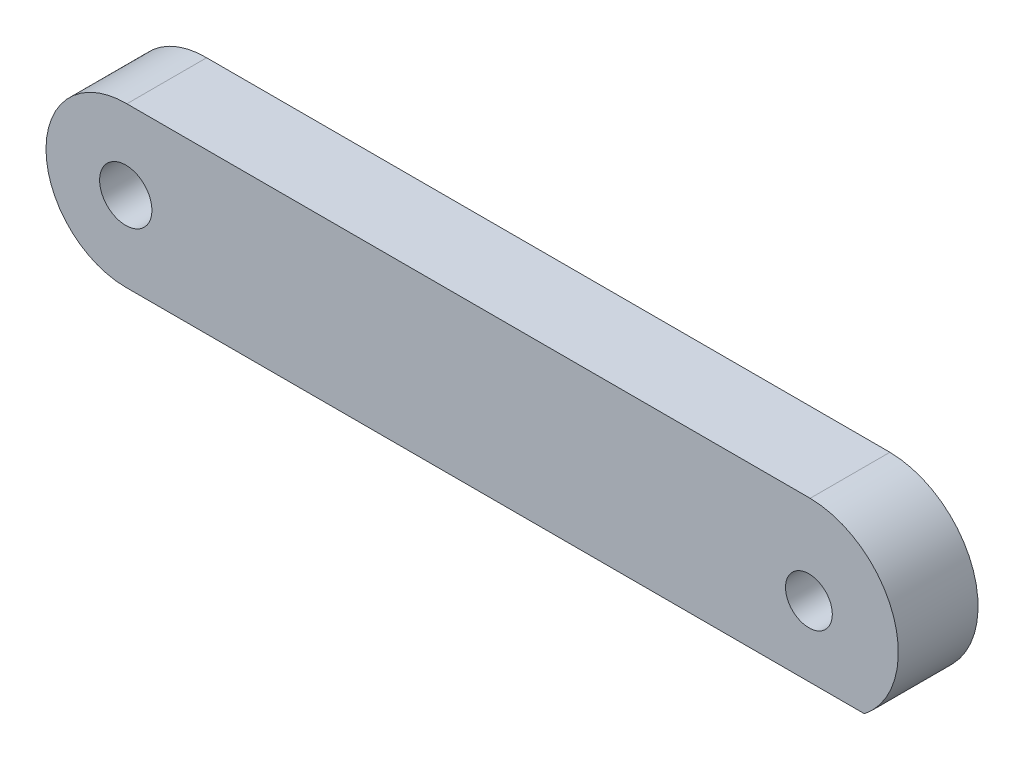
ISO-10303-21;
HEADER;
FILE_DESCRIPTION(('STEP AP214'),'2;1');
FILE_NAME('part.step','',(''),(''),'','','');
FILE_SCHEMA(('AUTOMOTIVE_DESIGN { 1 0 10303 214 1 1 1 1 }'));
ENDSEC;
DATA;
#1=APPLICATION_CONTEXT('core data for automotive mechanical design processes');
#2=APPLICATION_PROTOCOL_DEFINITION('international standard','automotive_design',2000,#1);
#3=PRODUCT_CONTEXT('',#1,'mechanical');
#4=PRODUCT('Part','Part','',(#3));
#5=PRODUCT_RELATED_PRODUCT_CATEGORY('part','',(#4));
#6=PRODUCT_DEFINITION_FORMATION('','',#4);
#7=PRODUCT_DEFINITION_CONTEXT('part definition',#1,'design');
#8=PRODUCT_DEFINITION('design','',#6,#7);
#9=PRODUCT_DEFINITION_SHAPE('','',#8);
#10=(LENGTH_UNIT() NAMED_UNIT(*) SI_UNIT(.MILLI.,.METRE.));
#11=(NAMED_UNIT(*) PLANE_ANGLE_UNIT() SI_UNIT($,.RADIAN.));
#12=(NAMED_UNIT(*) SI_UNIT($,.STERADIAN.) SOLID_ANGLE_UNIT());
#13=UNCERTAINTY_MEASURE_WITH_UNIT(LENGTH_MEASURE(1.E-05),#10,'distance_accuracy_value','');
#14=(GEOMETRIC_REPRESENTATION_CONTEXT(3) GLOBAL_UNCERTAINTY_ASSIGNED_CONTEXT((#13)) GLOBAL_UNIT_ASSIGNED_CONTEXT((#10,
#11,#12)) REPRESENTATION_CONTEXT('',''));
#15=CARTESIAN_POINT('',(0.,0.,0.));
#16=DIRECTION('',(0.,0.,1.));
#17=DIRECTION('',(1.,0.,0.));
#18=AXIS2_PLACEMENT_3D('',#15,#16,#17);
#19=CARTESIAN_POINT('',(-90.0654648380138,12.935260885265,60.9627633621813));
#20=DIRECTION('',(0.,0.,1.));
#21=DIRECTION('',(1.,0.,0.));
#22=AXIS2_PLACEMENT_3D('',#19,#20,#21);
#23=PLANE('',#22);
#24=CARTESIAN_POINT('',(-62.8665791114318,12.5502224829637,60.9627633621813));
#25=DIRECTION('',(0.,0.,1.));
#26=DIRECTION('',(1.,0.,0.));
#27=AXIS2_PLACEMENT_3D('',#24,#25,#26);
#28=CIRCLE('',#27,0.931600000000121);
#29=CARTESIAN_POINT('',(-61.9349791114317,12.5502224829637,60.9627633621813));
#30=VERTEX_POINT('',#29);
#31=EDGE_CURVE('E110',#30,#30,#28,.T.);
#32=ORIENTED_EDGE('',*,*,#31,.F.);
#33=EDGE_LOOP('',(#32));
#34=FACE_BOUND('',#33,.T.);
#35=CARTESIAN_POINT('',(-90.0654648380138,12.935260885265,60.9627633621813));
#36=DIRECTION('',(0.,0.,1.));
#37=DIRECTION('',(1.,0.,0.));
#38=AXIS2_PLACEMENT_3D('',#35,#36,#37);
#39=CIRCLE('',#38,3.17500000000017);
#40=CARTESIAN_POINT('',(-90.0205227598158,16.1099427921039,60.9627633621813));
#41=VERTEX_POINT('',#40);
#42=CARTESIAN_POINT('',(-90.0654648380138,9.76026088526512,60.9627633621813));
#43=VERTEX_POINT('',#42);
#44=EDGE_CURVE('E95',#41,#43,#39,.T.);
#45=ORIENTED_EDGE('',*,*,#44,.T.);
#46=DIRECTION('',(1.,0.,0.));
#47=VECTOR('',#46,1.);
#48=CARTESIAN_POINT('',(-90.0654648380138,9.76026088526512,60.9627633621813));
#49=LINE('',#48,#47);
#50=CARTESIAN_POINT('',(-60.6551853426268,9.76026088526448,60.9627633621813));
#51=VERTEX_POINT('',#50);
#52=EDGE_CURVE('E90',#43,#51,#49,.T.);
#53=ORIENTED_EDGE('',*,*,#52,.T.);
#54=CARTESIAN_POINT('',(-62.8665791114318,12.5502224829637,60.9627633621813));
#55=DIRECTION('',(0.,0.,1.));
#56=DIRECTION('',(-1.,0.,0.));
#57=AXIS2_PLACEMENT_3D('',#54,#55,#56);
#58=CIRCLE('',#57,3.56007698194099);
#59=CARTESIAN_POINT('',(-62.8161862742307,16.1099427921039,60.9627633621813));
#60=VERTEX_POINT('',#59);
#61=EDGE_CURVE('E93',#51,#60,#58,.T.);
#62=ORIENTED_EDGE('',*,*,#61,.T.);
#63=DIRECTION('',(-1.,0.,0.));
#64=VECTOR('',#63,1.);
#65=CARTESIAN_POINT('',(-62.8161862742307,16.1099427921039,60.9627633621813));
#66=LINE('',#65,#64);
#67=EDGE_CURVE('E60',#60,#41,#66,.T.);
#68=ORIENTED_EDGE('',*,*,#67,.T.);
#69=EDGE_LOOP('',(#45,#53,#62,#68));
#70=FACE_BOUND('',#69,.T.);
#71=CARTESIAN_POINT('',(-90.0654648380138,12.935260885265,60.9627633621813));
#72=DIRECTION('',(0.,0.,1.));
#73=DIRECTION('',(1.,0.,0.));
#74=AXIS2_PLACEMENT_3D('',#71,#72,#73);
#75=CIRCLE('',#74,1.04140000003301);
#76=CARTESIAN_POINT('',(-89.0240648379808,12.935260885265,60.9627633621813));
#77=VERTEX_POINT('',#76);
#78=EDGE_CURVE('E125',#77,#77,#75,.T.);
#79=ORIENTED_EDGE('',*,*,#78,.F.);
#80=EDGE_LOOP('',(#79));
#81=FACE_BOUND('',#80,.T.);
#82=ADVANCED_FACE('F43',(#34,#70,#81),#23,.T.);
#83=CARTESIAN_POINT('',(-90.0654648380138,12.935260885265,57.7877633621813));
#84=DIRECTION('',(0.,0.,1.));
#85=DIRECTION('',(1.,0.,0.));
#86=AXIS2_PLACEMENT_3D('',#83,#84,#85);
#87=PLANE('',#86);
#88=CARTESIAN_POINT('',(-90.0654648380138,12.935260885265,57.7877633621813));
#89=DIRECTION('',(0.,0.,1.));
#90=DIRECTION('',(1.,0.,0.));
#91=AXIS2_PLACEMENT_3D('',#88,#89,#90);
#92=CIRCLE('',#91,3.17500000000017);
#93=CARTESIAN_POINT('',(-90.0205227598158,16.1099427921039,57.7877633621813));
#94=VERTEX_POINT('',#93);
#95=CARTESIAN_POINT('',(-90.0654648380138,9.76026088526512,57.7877633621813));
#96=VERTEX_POINT('',#95);
#97=EDGE_CURVE('E107',#94,#96,#92,.T.);
#98=ORIENTED_EDGE('',*,*,#97,.F.);
#99=DIRECTION('',(-1.,0.,0.));
#100=VECTOR('',#99,1.);
#101=CARTESIAN_POINT('',(-62.8161862742307,16.1099427921039,57.7877633621813));
#102=LINE('',#101,#100);
#103=CARTESIAN_POINT('',(-62.8161862742307,16.1099427921039,57.7877633621813));
#104=VERTEX_POINT('',#103);
#105=EDGE_CURVE('E83',#104,#94,#102,.T.);
#106=ORIENTED_EDGE('',*,*,#105,.F.);
#107=CARTESIAN_POINT('',(-62.8665791114318,12.5502224829637,57.7877633621813));
#108=DIRECTION('',(0.,0.,1.));
#109=DIRECTION('',(-1.,0.,0.));
#110=AXIS2_PLACEMENT_3D('',#107,#108,#109);
#111=CIRCLE('',#110,3.56007698194099);
#112=CARTESIAN_POINT('',(-60.6551853426268,9.76026088526448,57.7877633621813));
#113=VERTEX_POINT('',#112);
#114=EDGE_CURVE('E77',#113,#104,#111,.T.);
#115=ORIENTED_EDGE('',*,*,#114,.F.);
#116=DIRECTION('',(1.,0.,0.));
#117=VECTOR('',#116,1.);
#118=CARTESIAN_POINT('',(-90.0654648380138,9.76026088526512,57.7877633621813));
#119=LINE('',#118,#117);
#120=EDGE_CURVE('E99',#96,#113,#119,.T.);
#121=ORIENTED_EDGE('',*,*,#120,.F.);
#122=EDGE_LOOP('',(#98,#106,#115,#121));
#123=FACE_BOUND('',#122,.T.);
#124=CARTESIAN_POINT('',(-62.8665791114318,12.5502224829637,57.7877633621813));
#125=DIRECTION('',(0.,0.,1.));
#126=DIRECTION('',(1.,0.,0.));
#127=AXIS2_PLACEMENT_3D('',#124,#125,#126);
#128=CIRCLE('',#127,0.931600000000121);
#129=CARTESIAN_POINT('',(-61.9349791114317,12.5502224829637,57.7877633621813));
#130=VERTEX_POINT('',#129);
#131=EDGE_CURVE('E122',#130,#130,#128,.T.);
#132=ORIENTED_EDGE('',*,*,#131,.T.);
#133=EDGE_LOOP('',(#132));
#134=FACE_BOUND('',#133,.T.);
#135=CARTESIAN_POINT('',(-90.0654648380138,12.935260885265,57.7877633621813));
#136=DIRECTION('',(0.,0.,1.));
#137=DIRECTION('',(1.,0.,0.));
#138=AXIS2_PLACEMENT_3D('',#135,#136,#137);
#139=CIRCLE('',#138,1.04140000003301);
#140=CARTESIAN_POINT('',(-89.0240648379808,12.935260885265,57.7877633621813));
#141=VERTEX_POINT('',#140);
#142=EDGE_CURVE('E128',#141,#141,#139,.T.);
#143=ORIENTED_EDGE('',*,*,#142,.T.);
#144=EDGE_LOOP('',(#143));
#145=FACE_BOUND('',#144,.T.);
#146=ADVANCED_FACE('F118',(#123,#134,#145),#87,.F.);
#147=CARTESIAN_POINT('',(-90.0654648380138,12.935260885265,60.9627633621813));
#148=DIRECTION('',(0.,0.,-1.));
#149=DIRECTION('',(-1.,0.,0.));
#150=AXIS2_PLACEMENT_3D('',#147,#148,#149);
#151=CYLINDRICAL_SURFACE('',#150,3.17500000000017);
#152=ORIENTED_EDGE('',*,*,#97,.T.);
#153=DIRECTION('',(0.,0.,-1.));
#154=VECTOR('',#153,1.);
#155=CARTESIAN_POINT('',(-90.0654648380138,9.76026088526512,60.9627633621813));
#156=LINE('',#155,#154);
#157=EDGE_CURVE('E11',#43,#96,#156,.T.);
#158=ORIENTED_EDGE('',*,*,#157,.F.);
#159=ORIENTED_EDGE('',*,*,#44,.F.);
#160=DIRECTION('',(0.,0.,-1.));
#161=VECTOR('',#160,1.);
#162=CARTESIAN_POINT('',(-90.0205227598158,16.1099427921039,60.9627633621813));
#163=LINE('',#162,#161);
#164=EDGE_CURVE('E103',#41,#94,#163,.T.);
#165=ORIENTED_EDGE('',*,*,#164,.T.);
#166=EDGE_LOOP('',(#152,#158,#159,#165));
#167=FACE_BOUND('',#166,.T.);
#168=ADVANCED_FACE('F45',(#167),#151,.T.);
#169=CARTESIAN_POINT('',(-90.0654648380138,9.76026088526512,60.9627633621813));
#170=DIRECTION('',(0.,1.,0.));
#171=DIRECTION('',(-1.,0.,0.));
#172=AXIS2_PLACEMENT_3D('',#169,#170,#171);
#173=PLANE('',#172);
#174=ORIENTED_EDGE('',*,*,#120,.T.);
#175=DIRECTION('',(0.,0.,-1.));
#176=VECTOR('',#175,1.);
#177=CARTESIAN_POINT('',(-60.6551853426268,9.76026088526448,60.9627633621813));
#178=LINE('',#177,#176);
#179=EDGE_CURVE('E52',#51,#113,#178,.T.);
#180=ORIENTED_EDGE('',*,*,#179,.F.);
#181=ORIENTED_EDGE('',*,*,#52,.F.);
#182=ORIENTED_EDGE('',*,*,#157,.T.);
#183=EDGE_LOOP('',(#174,#180,#181,#182));
#184=FACE_BOUND('',#183,.T.);
#185=ADVANCED_FACE('F98',(#184),#173,.F.);
#186=CARTESIAN_POINT('',(-62.8665791114318,12.5502224829637,60.9627633621813));
#187=DIRECTION('',(0.,0.,-1.));
#188=DIRECTION('',(-1.,0.,0.));
#189=AXIS2_PLACEMENT_3D('',#186,#187,#188);
#190=CYLINDRICAL_SURFACE('',#189,3.56007698194099);
#191=ORIENTED_EDGE('',*,*,#114,.T.);
#192=DIRECTION('',(0.,0.,-1.));
#193=VECTOR('',#192,1.);
#194=CARTESIAN_POINT('',(-62.8161862742307,16.1099427921039,60.9627633621813));
#195=LINE('',#194,#193);
#196=EDGE_CURVE('E100',#60,#104,#195,.T.);
#197=ORIENTED_EDGE('',*,*,#196,.F.);
#198=ORIENTED_EDGE('',*,*,#61,.F.);
#199=ORIENTED_EDGE('',*,*,#179,.T.);
#200=EDGE_LOOP('',(#191,#197,#198,#199));
#201=FACE_BOUND('',#200,.T.);
#202=ADVANCED_FACE('F101',(#201),#190,.T.);
#203=CARTESIAN_POINT('',(-62.8161862742307,16.1099427921039,60.9627633621813));
#204=DIRECTION('',(0.,-1.,0.));
#205=DIRECTION('',(0.,0.,-1.));
#206=AXIS2_PLACEMENT_3D('',#203,#204,#205);
#207=PLANE('',#206);
#208=ORIENTED_EDGE('',*,*,#105,.T.);
#209=ORIENTED_EDGE('',*,*,#164,.F.);
#210=ORIENTED_EDGE('',*,*,#67,.F.);
#211=ORIENTED_EDGE('',*,*,#196,.T.);
#212=EDGE_LOOP('',(#208,#209,#210,#211));
#213=FACE_BOUND('',#212,.T.);
#214=ADVANCED_FACE('F115',(#213),#207,.F.);
#215=CARTESIAN_POINT('',(-62.8665791114318,12.5502224829637,60.9627633621813));
#216=DIRECTION('',(0.,0.,-1.));
#217=DIRECTION('',(-1.,0.,0.));
#218=AXIS2_PLACEMENT_3D('',#215,#216,#217);
#219=CYLINDRICAL_SURFACE('',#218,0.931600000000121);
#220=ORIENTED_EDGE('',*,*,#31,.T.);
#221=EDGE_LOOP('',(#220));
#222=FACE_BOUND('',#221,.T.);
#223=ORIENTED_EDGE('',*,*,#131,.F.);
#224=EDGE_LOOP('',(#223));
#225=FACE_BOUND('',#224,.T.);
#226=ADVANCED_FACE('F145',(#222,#225),#219,.F.);
#227=CARTESIAN_POINT('',(-90.0654648380138,12.935260885265,60.9627633621813));
#228=DIRECTION('',(0.,0.,-1.));
#229=DIRECTION('',(-1.,0.,0.));
#230=AXIS2_PLACEMENT_3D('',#227,#228,#229);
#231=CYLINDRICAL_SURFACE('',#230,1.04140000003301);
#232=ORIENTED_EDGE('',*,*,#78,.T.);
#233=EDGE_LOOP('',(#232));
#234=FACE_BOUND('',#233,.T.);
#235=ORIENTED_EDGE('',*,*,#142,.F.);
#236=EDGE_LOOP('',(#235));
#237=FACE_BOUND('',#236,.T.);
#238=ADVANCED_FACE('F134',(#234,#237),#231,.F.);
#239=CLOSED_SHELL('',(#82,#146,#168,#185,#202,#214,#226,#238));
#240=MANIFOLD_SOLID_BREP('B2',#239);
#241=ADVANCED_BREP_SHAPE_REPRESENTATION('',(#18,#240),#14);
#242=SHAPE_DEFINITION_REPRESENTATION(#9,#241);
ENDSEC;
END-ISO-10303-21;
